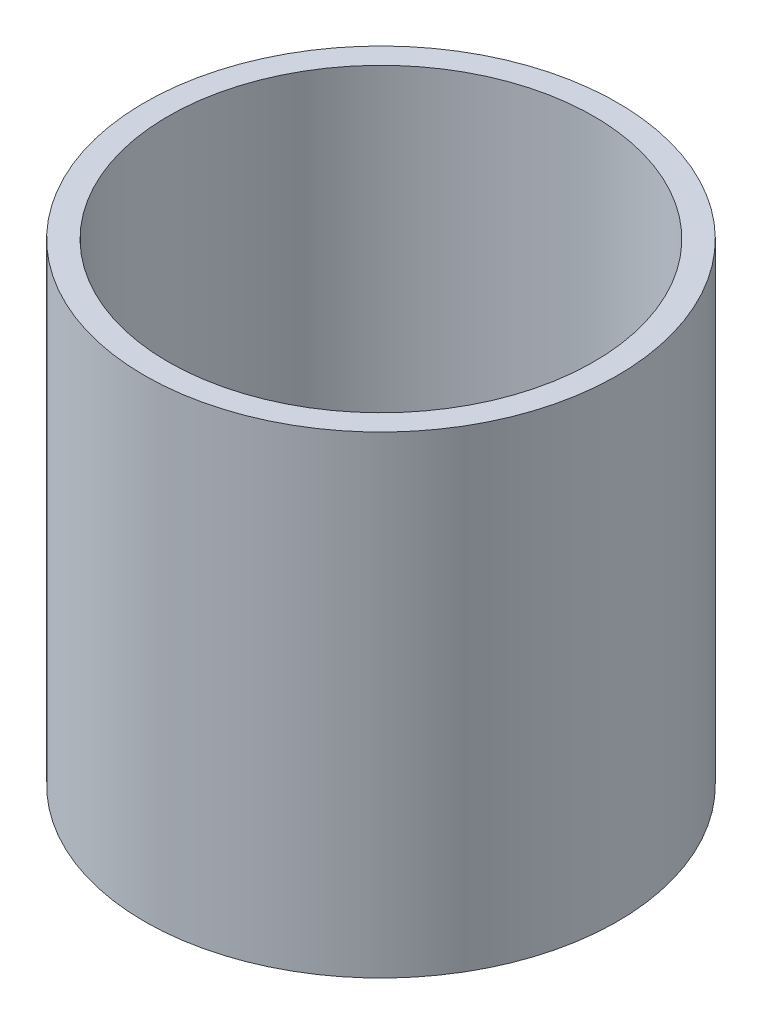
ISO-10303-21;
HEADER;
FILE_DESCRIPTION(('STEP AP214'),'2;1');
FILE_NAME('part.step','',(''),(''),'','','');
FILE_SCHEMA(('AUTOMOTIVE_DESIGN { 1 0 10303 214 1 1 1 1 }'));
ENDSEC;
DATA;
#1=APPLICATION_CONTEXT('core data for automotive mechanical design processes');
#2=APPLICATION_PROTOCOL_DEFINITION('international standard','automotive_design',2000,#1);
#3=PRODUCT_CONTEXT('',#1,'mechanical');
#4=PRODUCT('Part','Part','',(#3));
#5=PRODUCT_RELATED_PRODUCT_CATEGORY('part','',(#4));
#6=PRODUCT_DEFINITION_FORMATION('','',#4);
#7=PRODUCT_DEFINITION_CONTEXT('part definition',#1,'design');
#8=PRODUCT_DEFINITION('design','',#6,#7);
#9=PRODUCT_DEFINITION_SHAPE('','',#8);
#10=(LENGTH_UNIT() NAMED_UNIT(*) SI_UNIT(.MILLI.,.METRE.));
#11=(NAMED_UNIT(*) PLANE_ANGLE_UNIT() SI_UNIT($,.RADIAN.));
#12=(NAMED_UNIT(*) SI_UNIT($,.STERADIAN.) SOLID_ANGLE_UNIT());
#13=UNCERTAINTY_MEASURE_WITH_UNIT(LENGTH_MEASURE(1.E-05),#10,'distance_accuracy_value','');
#14=(GEOMETRIC_REPRESENTATION_CONTEXT(3) GLOBAL_UNCERTAINTY_ASSIGNED_CONTEXT((#13)) GLOBAL_UNIT_ASSIGNED_CONTEXT((#10,
#11,#12)) REPRESENTATION_CONTEXT('',''));
#15=CARTESIAN_POINT('',(0.,0.,0.));
#16=DIRECTION('',(0.,0.,1.));
#17=DIRECTION('',(1.,0.,0.));
#18=AXIS2_PLACEMENT_3D('',#15,#16,#17);
#19=CARTESIAN_POINT('',(0.,50.,0.));
#20=DIRECTION('',(0.,-1.,0.));
#21=DIRECTION('',(0.,0.,-1.));
#22=AXIS2_PLACEMENT_3D('',#19,#20,#21);
#23=CYLINDRICAL_SURFACE('',#22,25.);
#24=CARTESIAN_POINT('',(0.,50.,0.));
#25=DIRECTION('',(0.,1.,0.));
#26=DIRECTION('',(0.,0.,1.));
#27=AXIS2_PLACEMENT_3D('',#24,#25,#26);
#28=CIRCLE('',#27,25.);
#29=CARTESIAN_POINT('',(0.,50.,25.));
#30=VERTEX_POINT('',#29);
#31=EDGE_CURVE('E10',#30,#30,#28,.T.);
#32=ORIENTED_EDGE('',*,*,#31,.F.);
#33=EDGE_LOOP('',(#32));
#34=FACE_BOUND('',#33,.T.);
#35=CARTESIAN_POINT('',(0.,0.,0.));
#36=DIRECTION('',(0.,1.,0.));
#37=DIRECTION('',(0.,0.,1.));
#38=AXIS2_PLACEMENT_3D('',#35,#36,#37);
#39=CIRCLE('',#38,25.);
#40=CARTESIAN_POINT('',(0.,0.,25.));
#41=VERTEX_POINT('',#40);
#42=EDGE_CURVE('E41',#41,#41,#39,.T.);
#43=ORIENTED_EDGE('',*,*,#42,.T.);
#44=EDGE_LOOP('',(#43));
#45=FACE_BOUND('',#44,.T.);
#46=ADVANCED_FACE('F38',(#34,#45),#23,.T.);
#47=CARTESIAN_POINT('',(0.,50.,0.));
#48=DIRECTION('',(0.,1.,0.));
#49=DIRECTION('',(0.,0.,1.));
#50=AXIS2_PLACEMENT_3D('',#47,#48,#49);
#51=PLANE('',#50);
#52=CARTESIAN_POINT('',(0.,50.,0.));
#53=DIRECTION('',(0.,1.,0.));
#54=DIRECTION('',(0.,0.,1.));
#55=AXIS2_PLACEMENT_3D('',#52,#53,#54);
#56=CIRCLE('',#55,22.5);
#57=CARTESIAN_POINT('',(0.,50.,22.5));
#58=VERTEX_POINT('',#57);
#59=EDGE_CURVE('E50',#58,#58,#56,.T.);
#60=ORIENTED_EDGE('',*,*,#59,.F.);
#61=EDGE_LOOP('',(#60));
#62=FACE_BOUND('',#61,.T.);
#63=ORIENTED_EDGE('',*,*,#31,.T.);
#64=EDGE_LOOP('',(#63));
#65=FACE_BOUND('',#64,.T.);
#66=ADVANCED_FACE('F65',(#62,#65),#51,.T.);
#67=CARTESIAN_POINT('',(0.,0.,0.));
#68=DIRECTION('',(0.,1.,0.));
#69=DIRECTION('',(0.,0.,1.));
#70=AXIS2_PLACEMENT_3D('',#67,#68,#69);
#71=PLANE('',#70);
#72=ORIENTED_EDGE('',*,*,#42,.F.);
#73=EDGE_LOOP('',(#72));
#74=FACE_BOUND('',#73,.T.);
#75=ADVANCED_FACE('F61',(#74),#71,.F.);
#76=CARTESIAN_POINT('',(0.,2.5,0.));
#77=DIRECTION('',(0.,1.,0.));
#78=DIRECTION('',(0.,0.,1.));
#79=AXIS2_PLACEMENT_3D('',#76,#77,#78);
#80=CYLINDRICAL_SURFACE('',#79,22.5);
#81=CARTESIAN_POINT('',(0.,2.5,0.));
#82=DIRECTION('',(0.,1.,0.));
#83=DIRECTION('',(0.,0.,1.));
#84=AXIS2_PLACEMENT_3D('',#81,#82,#83);
#85=CIRCLE('',#84,22.5);
#86=CARTESIAN_POINT('',(0.,2.5,22.5));
#87=VERTEX_POINT('',#86);
#88=EDGE_CURVE('E48',#87,#87,#85,.T.);
#89=ORIENTED_EDGE('',*,*,#88,.F.);
#90=EDGE_LOOP('',(#89));
#91=FACE_BOUND('',#90,.T.);
#92=ORIENTED_EDGE('',*,*,#59,.T.);
#93=EDGE_LOOP('',(#92));
#94=FACE_BOUND('',#93,.T.);
#95=ADVANCED_FACE('F58',(#91,#94),#80,.F.);
#96=CARTESIAN_POINT('',(0.,2.5,0.));
#97=DIRECTION('',(0.,1.,0.));
#98=DIRECTION('',(0.,0.,1.));
#99=AXIS2_PLACEMENT_3D('',#96,#97,#98);
#100=PLANE('',#99);
#101=ORIENTED_EDGE('',*,*,#88,.T.);
#102=EDGE_LOOP('',(#101));
#103=FACE_BOUND('',#102,.T.);
#104=ADVANCED_FACE('F56',(#103),#100,.T.);
#105=CLOSED_SHELL('',(#46,#66,#75,#95,#104));
#106=MANIFOLD_SOLID_BREP('B2',#105);
#107=ADVANCED_BREP_SHAPE_REPRESENTATION('',(#18,#106),#14);
#108=SHAPE_DEFINITION_REPRESENTATION(#9,#107);
ENDSEC;
END-ISO-10303-21;
